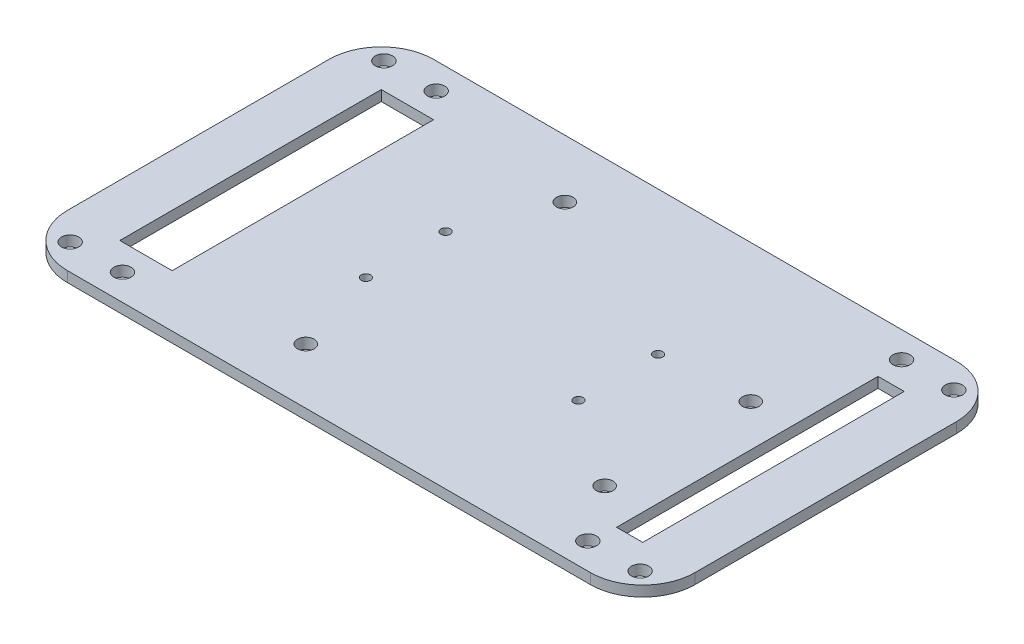
ISO-10303-21;
HEADER;
FILE_DESCRIPTION(('STEP AP214'),'2;1');
FILE_NAME('part.step','',(''),(''),'','','');
FILE_SCHEMA(('AUTOMOTIVE_DESIGN { 1 0 10303 214 1 1 1 1 }'));
ENDSEC;
DATA;
#1=APPLICATION_CONTEXT('core data for automotive mechanical design processes');
#2=APPLICATION_PROTOCOL_DEFINITION('international standard','automotive_design',2000,#1);
#3=PRODUCT_CONTEXT('',#1,'mechanical');
#4=PRODUCT('Part','Part','',(#3));
#5=PRODUCT_RELATED_PRODUCT_CATEGORY('part','',(#4));
#6=PRODUCT_DEFINITION_FORMATION('','',#4);
#7=PRODUCT_DEFINITION_CONTEXT('part definition',#1,'design');
#8=PRODUCT_DEFINITION('design','',#6,#7);
#9=PRODUCT_DEFINITION_SHAPE('','',#8);
#10=(LENGTH_UNIT() NAMED_UNIT(*) SI_UNIT(.MILLI.,.METRE.));
#11=(NAMED_UNIT(*) PLANE_ANGLE_UNIT() SI_UNIT($,.RADIAN.));
#12=(NAMED_UNIT(*) SI_UNIT($,.STERADIAN.) SOLID_ANGLE_UNIT());
#13=UNCERTAINTY_MEASURE_WITH_UNIT(LENGTH_MEASURE(1.E-05),#10,'distance_accuracy_value','');
#14=(GEOMETRIC_REPRESENTATION_CONTEXT(3) GLOBAL_UNCERTAINTY_ASSIGNED_CONTEXT((#13)) GLOBAL_UNIT_ASSIGNED_CONTEXT((#10,
#11,#12)) REPRESENTATION_CONTEXT('',''));
#15=CARTESIAN_POINT('',(0.,0.,0.));
#16=DIRECTION('',(0.,0.,1.));
#17=DIRECTION('',(1.,0.,0.));
#18=AXIS2_PLACEMENT_3D('',#15,#16,#17);
#19=CARTESIAN_POINT('',(110.,2.,-10.));
#20=DIRECTION('',(0.,-1.,0.));
#21=DIRECTION('',(0.,0.,-1.));
#22=AXIS2_PLACEMENT_3D('',#19,#20,#21);
#23=CYLINDRICAL_SURFACE('',#22,10.);
#24=DIRECTION('',(0.,-1.,0.));
#25=VECTOR('',#24,1.);
#26=CARTESIAN_POINT('',(120.,2.,-10.));
#27=LINE('',#26,#25);
#28=CARTESIAN_POINT('',(120.,2.,-10.));
#29=VERTEX_POINT('',#28);
#30=CARTESIAN_POINT('',(120.,0.,-10.));
#31=VERTEX_POINT('',#30);
#32=EDGE_CURVE('E271',#29,#31,#27,.T.);
#33=ORIENTED_EDGE('',*,*,#32,.F.);
#34=CARTESIAN_POINT('',(110.,2.,-10.));
#35=DIRECTION('',(0.,-1.,0.));
#36=DIRECTION('',(0.,0.,-1.));
#37=AXIS2_PLACEMENT_3D('',#34,#35,#36);
#38=CIRCLE('',#37,10.);
#39=CARTESIAN_POINT('',(110.,2.,0.));
#40=VERTEX_POINT('',#39);
#41=EDGE_CURVE('E277',#40,#29,#38,.F.);
#42=ORIENTED_EDGE('',*,*,#41,.F.);
#43=DIRECTION('',(0.,-1.,0.));
#44=VECTOR('',#43,1.);
#45=CARTESIAN_POINT('',(110.,2.,0.));
#46=LINE('',#45,#44);
#47=CARTESIAN_POINT('',(110.,0.,0.));
#48=VERTEX_POINT('',#47);
#49=EDGE_CURVE('E274',#48,#40,#46,.F.);
#50=ORIENTED_EDGE('',*,*,#49,.F.);
#51=CARTESIAN_POINT('',(110.,0.,-10.));
#52=DIRECTION('',(0.,-1.,0.));
#53=DIRECTION('',(0.,0.,-1.));
#54=AXIS2_PLACEMENT_3D('',#51,#52,#53);
#55=CIRCLE('',#54,10.);
#56=EDGE_CURVE('E279',#31,#48,#55,.T.);
#57=ORIENTED_EDGE('',*,*,#56,.F.);
#58=EDGE_LOOP('',(#33,#42,#50,#57));
#59=FACE_BOUND('',#58,.T.);
#60=ADVANCED_FACE('F35',(#59),#23,.T.);
#61=CARTESIAN_POINT('',(110.,2.,-60.));
#62=DIRECTION('',(0.,-1.,0.));
#63=DIRECTION('',(0.,0.,-1.));
#64=AXIS2_PLACEMENT_3D('',#61,#62,#63);
#65=CYLINDRICAL_SURFACE('',#64,10.);
#66=DIRECTION('',(0.,-1.,0.));
#67=VECTOR('',#66,1.);
#68=CARTESIAN_POINT('',(110.,2.,-70.));
#69=LINE('',#68,#67);
#70=CARTESIAN_POINT('',(110.,2.,-70.));
#71=VERTEX_POINT('',#70);
#72=CARTESIAN_POINT('',(110.,0.,-70.));
#73=VERTEX_POINT('',#72);
#74=EDGE_CURVE('E260',#71,#73,#69,.T.);
#75=ORIENTED_EDGE('',*,*,#74,.F.);
#76=CARTESIAN_POINT('',(110.,2.,-60.));
#77=DIRECTION('',(0.,-1.,0.));
#78=DIRECTION('',(0.,0.,-1.));
#79=AXIS2_PLACEMENT_3D('',#76,#77,#78);
#80=CIRCLE('',#79,10.);
#81=CARTESIAN_POINT('',(120.,2.,-60.));
#82=VERTEX_POINT('',#81);
#83=EDGE_CURVE('E266',#82,#71,#80,.F.);
#84=ORIENTED_EDGE('',*,*,#83,.F.);
#85=DIRECTION('',(0.,-1.,0.));
#86=VECTOR('',#85,1.);
#87=CARTESIAN_POINT('',(120.,2.,-60.));
#88=LINE('',#87,#86);
#89=CARTESIAN_POINT('',(120.,0.,-60.));
#90=VERTEX_POINT('',#89);
#91=EDGE_CURVE('E263',#90,#82,#88,.F.);
#92=ORIENTED_EDGE('',*,*,#91,.F.);
#93=CARTESIAN_POINT('',(110.,0.,-60.));
#94=DIRECTION('',(0.,-1.,0.));
#95=DIRECTION('',(0.,0.,-1.));
#96=AXIS2_PLACEMENT_3D('',#93,#94,#95);
#97=CIRCLE('',#96,10.);
#98=EDGE_CURVE('E268',#73,#90,#97,.T.);
#99=ORIENTED_EDGE('',*,*,#98,.F.);
#100=EDGE_LOOP('',(#75,#84,#92,#99));
#101=FACE_BOUND('',#100,.T.);
#102=ADVANCED_FACE('F386',(#101),#65,.T.);
#103=CARTESIAN_POINT('',(10.,2.,-60.));
#104=DIRECTION('',(0.,1.,0.));
#105=DIRECTION('',(0.,0.,1.));
#106=AXIS2_PLACEMENT_3D('',#103,#104,#105);
#107=CYLINDRICAL_SURFACE('',#106,10.);
#108=DIRECTION('',(0.,1.,0.));
#109=VECTOR('',#108,1.);
#110=CARTESIAN_POINT('',(10.,2.,-70.));
#111=LINE('',#110,#109);
#112=CARTESIAN_POINT('',(10.,0.,-70.));
#113=VERTEX_POINT('',#112);
#114=CARTESIAN_POINT('',(10.,2.,-70.));
#115=VERTEX_POINT('',#114);
#116=EDGE_CURVE('E249',#113,#115,#111,.T.);
#117=ORIENTED_EDGE('',*,*,#116,.F.);
#118=CARTESIAN_POINT('',(10.,0.,-60.));
#119=DIRECTION('',(0.,-1.,0.));
#120=DIRECTION('',(0.,0.,-1.));
#121=AXIS2_PLACEMENT_3D('',#118,#119,#120);
#122=CIRCLE('',#121,10.);
#123=CARTESIAN_POINT('',(0.,0.,-60.));
#124=VERTEX_POINT('',#123);
#125=EDGE_CURVE('E255',#124,#113,#122,.T.);
#126=ORIENTED_EDGE('',*,*,#125,.F.);
#127=DIRECTION('',(0.,1.,0.));
#128=VECTOR('',#127,1.);
#129=CARTESIAN_POINT('',(0.,2.,-60.));
#130=LINE('',#129,#128);
#131=CARTESIAN_POINT('',(0.,2.,-60.));
#132=VERTEX_POINT('',#131);
#133=EDGE_CURVE('E252',#132,#124,#130,.F.);
#134=ORIENTED_EDGE('',*,*,#133,.F.);
#135=CARTESIAN_POINT('',(10.,2.,-60.));
#136=DIRECTION('',(0.,-1.,0.));
#137=DIRECTION('',(0.,0.,-1.));
#138=AXIS2_PLACEMENT_3D('',#135,#136,#137);
#139=CIRCLE('',#138,10.);
#140=EDGE_CURVE('E258',#115,#132,#139,.F.);
#141=ORIENTED_EDGE('',*,*,#140,.F.);
#142=EDGE_LOOP('',(#117,#126,#134,#141));
#143=FACE_BOUND('',#142,.T.);
#144=ADVANCED_FACE('F379',(#143),#107,.T.);
#145=CARTESIAN_POINT('',(10.,2.,-10.));
#146=DIRECTION('',(0.,1.,0.));
#147=DIRECTION('',(0.,0.,1.));
#148=AXIS2_PLACEMENT_3D('',#145,#146,#147);
#149=CYLINDRICAL_SURFACE('',#148,10.);
#150=DIRECTION('',(0.,1.,0.));
#151=VECTOR('',#150,1.);
#152=CARTESIAN_POINT('',(0.,2.,-10.));
#153=LINE('',#152,#151);
#154=CARTESIAN_POINT('',(0.,0.,-10.));
#155=VERTEX_POINT('',#154);
#156=CARTESIAN_POINT('',(0.,2.,-10.));
#157=VERTEX_POINT('',#156);
#158=EDGE_CURVE('E231',#155,#157,#153,.T.);
#159=ORIENTED_EDGE('',*,*,#158,.F.);
#160=CARTESIAN_POINT('',(10.,0.,-10.));
#161=DIRECTION('',(0.,-1.,0.));
#162=DIRECTION('',(0.,0.,-1.));
#163=AXIS2_PLACEMENT_3D('',#160,#161,#162);
#164=CIRCLE('',#163,10.);
#165=CARTESIAN_POINT('',(10.,0.,0.));
#166=VERTEX_POINT('',#165);
#167=EDGE_CURVE('E244',#166,#155,#164,.T.);
#168=ORIENTED_EDGE('',*,*,#167,.F.);
#169=DIRECTION('',(0.,1.,0.));
#170=VECTOR('',#169,1.);
#171=CARTESIAN_POINT('',(10.,2.,0.));
#172=LINE('',#171,#170);
#173=CARTESIAN_POINT('',(10.,2.,0.));
#174=VERTEX_POINT('',#173);
#175=EDGE_CURVE('E241',#174,#166,#172,.F.);
#176=ORIENTED_EDGE('',*,*,#175,.F.);
#177=CARTESIAN_POINT('',(10.,2.,-10.));
#178=DIRECTION('',(0.,-1.,0.));
#179=DIRECTION('',(0.,0.,-1.));
#180=AXIS2_PLACEMENT_3D('',#177,#178,#179);
#181=CIRCLE('',#180,10.);
#182=EDGE_CURVE('E247',#157,#174,#181,.F.);
#183=ORIENTED_EDGE('',*,*,#182,.F.);
#184=EDGE_LOOP('',(#159,#168,#176,#183));
#185=FACE_BOUND('',#184,.T.);
#186=ADVANCED_FACE('F369',(#185),#149,.T.);
#187=CARTESIAN_POINT('',(0.,2.,0.));
#188=DIRECTION('',(0.,-1.,0.));
#189=DIRECTION('',(0.,0.,-1.));
#190=AXIS2_PLACEMENT_3D('',#187,#188,#189);
#191=PLANE('',#190);
#192=CARTESIAN_POINT('',(39.68,2.,-27.38));
#193=DIRECTION('',(0.,1.,0.));
#194=DIRECTION('',(0.,0.,1.));
#195=AXIS2_PLACEMENT_3D('',#192,#193,#194);
#196=CIRCLE('',#195,0.899999999999996);
#197=CARTESIAN_POINT('',(39.68,2.,-26.48));
#198=VERTEX_POINT('',#197);
#199=EDGE_CURVE('E328',#198,#198,#196,.T.);
#200=ORIENTED_EDGE('',*,*,#199,.F.);
#201=EDGE_LOOP('',(#200));
#202=FACE_BOUND('',#201,.T.);
#203=CARTESIAN_POINT('',(80.32,2.,-42.62));
#204=DIRECTION('',(0.,1.,0.));
#205=DIRECTION('',(0.,0.,1.));
#206=AXIS2_PLACEMENT_3D('',#203,#204,#205);
#207=CIRCLE('',#206,0.900000000000003);
#208=CARTESIAN_POINT('',(80.32,2.,-41.72));
#209=VERTEX_POINT('',#208);
#210=EDGE_CURVE('E716',#209,#209,#207,.T.);
#211=ORIENTED_EDGE('',*,*,#210,.F.);
#212=EDGE_LOOP('',(#211));
#213=FACE_BOUND('',#212,.T.);
#214=CARTESIAN_POINT('',(80.32,2.,-27.38));
#215=DIRECTION('',(0.,1.,0.));
#216=DIRECTION('',(0.,0.,1.));
#217=AXIS2_PLACEMENT_3D('',#214,#215,#216);
#218=CIRCLE('',#217,0.900000000000003);
#219=CARTESIAN_POINT('',(80.32,2.,-26.48));
#220=VERTEX_POINT('',#219);
#221=EDGE_CURVE('E341',#220,#220,#218,.T.);
#222=ORIENTED_EDGE('',*,*,#221,.F.);
#223=EDGE_LOOP('',(#222));
#224=FACE_BOUND('',#223,.T.);
#225=CARTESIAN_POINT('',(39.68,2.,-42.62));
#226=DIRECTION('',(0.,1.,0.));
#227=DIRECTION('',(0.,0.,1.));
#228=AXIS2_PLACEMENT_3D('',#225,#226,#227);
#229=CIRCLE('',#228,0.899999999999996);
#230=CARTESIAN_POINT('',(39.68,2.,-41.72));
#231=VERTEX_POINT('',#230);
#232=EDGE_CURVE('E324',#231,#231,#229,.T.);
#233=ORIENTED_EDGE('',*,*,#232,.F.);
#234=EDGE_LOOP('',(#233));
#235=FACE_BOUND('',#234,.T.);
#236=CARTESIAN_POINT('',(104.5,2.,-5.));
#237=DIRECTION('',(0.,1.,0.));
#238=DIRECTION('',(0.,0.,1.));
#239=AXIS2_PLACEMENT_3D('',#236,#237,#238);
#240=CIRCLE('',#239,1.65);
#241=CARTESIAN_POINT('',(104.5,2.,-3.35));
#242=VERTEX_POINT('',#241);
#243=EDGE_CURVE('E323',#242,#242,#240,.T.);
#244=ORIENTED_EDGE('',*,*,#243,.F.);
#245=EDGE_LOOP('',(#244));
#246=FACE_BOUND('',#245,.T.);
#247=CARTESIAN_POINT('',(15.5,2.,-5.));
#248=DIRECTION('',(0.,1.,0.));
#249=DIRECTION('',(0.,0.,1.));
#250=AXIS2_PLACEMENT_3D('',#247,#248,#249);
#251=CIRCLE('',#250,1.65);
#252=CARTESIAN_POINT('',(15.5,2.,-3.35));
#253=VERTEX_POINT('',#252);
#254=EDGE_CURVE('E350',#253,#253,#251,.T.);
#255=ORIENTED_EDGE('',*,*,#254,.F.);
#256=EDGE_LOOP('',(#255));
#257=FACE_BOUND('',#256,.T.);
#258=CARTESIAN_POINT('',(104.5,2.,-65.));
#259=DIRECTION('',(0.,1.,0.));
#260=DIRECTION('',(0.,0.,1.));
#261=AXIS2_PLACEMENT_3D('',#258,#259,#260);
#262=CIRCLE('',#261,1.65);
#263=CARTESIAN_POINT('',(104.5,2.,-63.35));
#264=VERTEX_POINT('',#263);
#265=EDGE_CURVE('E347',#264,#264,#262,.T.);
#266=ORIENTED_EDGE('',*,*,#265,.F.);
#267=EDGE_LOOP('',(#266));
#268=FACE_BOUND('',#267,.T.);
#269=CARTESIAN_POINT('',(15.5,2.,-65.));
#270=DIRECTION('',(0.,1.,0.));
#271=DIRECTION('',(0.,0.,1.));
#272=AXIS2_PLACEMENT_3D('',#269,#270,#271);
#273=CIRCLE('',#272,1.65);
#274=CARTESIAN_POINT('',(15.5,2.,-63.35));
#275=VERTEX_POINT('',#274);
#276=EDGE_CURVE('E343',#275,#275,#273,.T.);
#277=ORIENTED_EDGE('',*,*,#276,.F.);
#278=EDGE_LOOP('',(#277));
#279=FACE_BOUND('',#278,.T.);
#280=CARTESIAN_POINT('',(5.49999999999999,2.,-65.));
#281=DIRECTION('',(0.,1.,0.));
#282=DIRECTION('',(0.,0.,1.));
#283=AXIS2_PLACEMENT_3D('',#280,#281,#282);
#284=CIRCLE('',#283,1.65);
#285=CARTESIAN_POINT('',(5.49999999999999,2.,-63.35));
#286=VERTEX_POINT('',#285);
#287=EDGE_CURVE('E346',#286,#286,#284,.T.);
#288=ORIENTED_EDGE('',*,*,#287,.F.);
#289=EDGE_LOOP('',(#288));
#290=FACE_BOUND('',#289,.T.);
#291=CARTESIAN_POINT('',(114.5,2.,-65.));
#292=DIRECTION('',(0.,1.,0.));
#293=DIRECTION('',(0.,0.,1.));
#294=AXIS2_PLACEMENT_3D('',#291,#292,#293);
#295=CIRCLE('',#294,1.65);
#296=CARTESIAN_POINT('',(114.5,2.,-63.35));
#297=VERTEX_POINT('',#296);
#298=EDGE_CURVE('E357',#297,#297,#295,.T.);
#299=ORIENTED_EDGE('',*,*,#298,.F.);
#300=EDGE_LOOP('',(#299));
#301=FACE_BOUND('',#300,.T.);
#302=CARTESIAN_POINT('',(114.5,2.,-5.));
#303=DIRECTION('',(0.,1.,0.));
#304=DIRECTION('',(0.,0.,1.));
#305=AXIS2_PLACEMENT_3D('',#302,#303,#304);
#306=CIRCLE('',#305,1.65);
#307=CARTESIAN_POINT('',(114.5,2.,-3.35));
#308=VERTEX_POINT('',#307);
#309=EDGE_CURVE('E302',#308,#308,#306,.T.);
#310=ORIENTED_EDGE('',*,*,#309,.F.);
#311=EDGE_LOOP('',(#310));
#312=FACE_BOUND('',#311,.T.);
#313=CARTESIAN_POINT('',(5.5,2.,-5.));
#314=DIRECTION('',(0.,1.,0.));
#315=DIRECTION('',(0.,0.,1.));
#316=AXIS2_PLACEMENT_3D('',#313,#314,#315);
#317=CIRCLE('',#316,1.65);
#318=CARTESIAN_POINT('',(5.5,2.,-3.35));
#319=VERTEX_POINT('',#318);
#320=EDGE_CURVE('E297',#319,#319,#317,.T.);
#321=ORIENTED_EDGE('',*,*,#320,.F.);
#322=EDGE_LOOP('',(#321));
#323=FACE_BOUND('',#322,.T.);
#324=DIRECTION('',(-1.,0.,0.));
#325=VECTOR('',#324,1.);
#326=CARTESIAN_POINT('',(110.,2.,-60.));
#327=LINE('',#326,#325);
#328=CARTESIAN_POINT('',(110.,2.,-60.));
#329=VERTEX_POINT('',#328);
#330=CARTESIAN_POINT('',(105.,2.,-60.));
#331=VERTEX_POINT('',#330);
#332=EDGE_CURVE('E160',#329,#331,#327,.T.);
#333=ORIENTED_EDGE('',*,*,#332,.F.);
#334=DIRECTION('',(0.,0.,-1.));
#335=VECTOR('',#334,1.);
#336=CARTESIAN_POINT('',(110.,2.,-60.));
#337=LINE('',#336,#335);
#338=CARTESIAN_POINT('',(110.,2.,-10.));
#339=VERTEX_POINT('',#338);
#340=EDGE_CURVE('E51',#339,#329,#337,.T.);
#341=ORIENTED_EDGE('',*,*,#340,.F.);
#342=DIRECTION('',(1.,0.,0.));
#343=VECTOR('',#342,1.);
#344=CARTESIAN_POINT('',(110.,2.,-10.));
#345=LINE('',#344,#343);
#346=CARTESIAN_POINT('',(105.,2.,-10.));
#347=VERTEX_POINT('',#346);
#348=EDGE_CURVE('E167',#347,#339,#345,.T.);
#349=ORIENTED_EDGE('',*,*,#348,.F.);
#350=DIRECTION('',(0.,0.,1.));
#351=VECTOR('',#350,1.);
#352=CARTESIAN_POINT('',(105.,2.,-60.));
#353=LINE('',#352,#351);
#354=EDGE_CURVE('E151',#331,#347,#353,.T.);
#355=ORIENTED_EDGE('',*,*,#354,.F.);
#356=EDGE_LOOP('',(#333,#341,#349,#355));
#357=FACE_BOUND('',#356,.T.);
#358=DIRECTION('',(-1.,0.,0.));
#359=VECTOR('',#358,1.);
#360=CARTESIAN_POINT('',(20.,2.,-60.));
#361=LINE('',#360,#359);
#362=CARTESIAN_POINT('',(20.,2.,-60.));
#363=VERTEX_POINT('',#362);
#364=CARTESIAN_POINT('',(10.,2.,-60.));
#365=VERTEX_POINT('',#364);
#366=EDGE_CURVE('E178',#363,#365,#361,.T.);
#367=ORIENTED_EDGE('',*,*,#366,.F.);
#368=DIRECTION('',(0.,0.,-1.));
#369=VECTOR('',#368,1.);
#370=CARTESIAN_POINT('',(20.,2.,-60.));
#371=LINE('',#370,#369);
#372=CARTESIAN_POINT('',(20.,2.,-10.));
#373=VERTEX_POINT('',#372);
#374=EDGE_CURVE('E174',#373,#363,#371,.T.);
#375=ORIENTED_EDGE('',*,*,#374,.F.);
#376=DIRECTION('',(1.,0.,0.));
#377=VECTOR('',#376,1.);
#378=CARTESIAN_POINT('',(20.,2.,-10.));
#379=LINE('',#378,#377);
#380=CARTESIAN_POINT('',(10.,2.,-10.));
#381=VERTEX_POINT('',#380);
#382=EDGE_CURVE('E184',#381,#373,#379,.T.);
#383=ORIENTED_EDGE('',*,*,#382,.F.);
#384=DIRECTION('',(0.,0.,1.));
#385=VECTOR('',#384,1.);
#386=CARTESIAN_POINT('',(10.,2.,-60.));
#387=LINE('',#386,#385);
#388=EDGE_CURVE('E181',#365,#381,#387,.T.);
#389=ORIENTED_EDGE('',*,*,#388,.F.);
#390=EDGE_LOOP('',(#367,#375,#383,#389));
#391=FACE_BOUND('',#390,.T.);
#392=DIRECTION('',(1.,0.,0.));
#393=VECTOR('',#392,1.);
#394=CARTESIAN_POINT('',(0.,2.,0.));
#395=LINE('',#394,#393);
#396=EDGE_CURVE('E223',#174,#40,#395,.T.);
#397=ORIENTED_EDGE('',*,*,#396,.T.);
#398=ORIENTED_EDGE('',*,*,#41,.T.);
#399=DIRECTION('',(0.,0.,-1.));
#400=VECTOR('',#399,1.);
#401=CARTESIAN_POINT('',(120.,2.,0.));
#402=LINE('',#401,#400);
#403=EDGE_CURVE('E227',#29,#82,#402,.T.);
#404=ORIENTED_EDGE('',*,*,#403,.T.);
#405=ORIENTED_EDGE('',*,*,#83,.T.);
#406=DIRECTION('',(-1.,0.,0.));
#407=VECTOR('',#406,1.);
#408=CARTESIAN_POINT('',(0.,2.,-70.));
#409=LINE('',#408,#407);
#410=EDGE_CURVE('E229',#71,#115,#409,.T.);
#411=ORIENTED_EDGE('',*,*,#410,.T.);
#412=ORIENTED_EDGE('',*,*,#140,.T.);
#413=DIRECTION('',(0.,0.,1.));
#414=VECTOR('',#413,1.);
#415=CARTESIAN_POINT('',(0.,2.,0.));
#416=LINE('',#415,#414);
#417=EDGE_CURVE('E221',#132,#157,#416,.T.);
#418=ORIENTED_EDGE('',*,*,#417,.T.);
#419=ORIENTED_EDGE('',*,*,#182,.T.);
#420=EDGE_LOOP('',(#397,#398,#404,#405,#411,#412,#418,#419));
#421=FACE_BOUND('',#420,.T.);
#422=CARTESIAN_POINT('',(97.,2.,-43.66));
#423=DIRECTION('',(0.,1.,0.));
#424=DIRECTION('',(0.,0.,1.));
#425=AXIS2_PLACEMENT_3D('',#422,#423,#424);
#426=CIRCLE('',#425,1.60000000000001);
#427=CARTESIAN_POINT('',(97.,2.,-42.06));
#428=VERTEX_POINT('',#427);
#429=EDGE_CURVE('E215',#428,#428,#426,.T.);
#430=ORIENTED_EDGE('',*,*,#429,.F.);
#431=EDGE_LOOP('',(#430));
#432=FACE_BOUND('',#431,.T.);
#433=CARTESIAN_POINT('',(97.,2.,-15.72));
#434=DIRECTION('',(0.,1.,0.));
#435=DIRECTION('',(0.,0.,1.));
#436=AXIS2_PLACEMENT_3D('',#433,#434,#435);
#437=CIRCLE('',#436,1.6);
#438=CARTESIAN_POINT('',(97.,2.,-14.12));
#439=VERTEX_POINT('',#438);
#440=EDGE_CURVE('E209',#439,#439,#437,.T.);
#441=ORIENTED_EDGE('',*,*,#440,.F.);
#442=EDGE_LOOP('',(#441));
#443=FACE_BOUND('',#442,.T.);
#444=CARTESIAN_POINT('',(46.2,2.,-58.9));
#445=DIRECTION('',(0.,1.,0.));
#446=DIRECTION('',(0.,0.,1.));
#447=AXIS2_PLACEMENT_3D('',#444,#445,#446);
#448=CIRCLE('',#447,1.6);
#449=CARTESIAN_POINT('',(46.2,2.,-57.3));
#450=VERTEX_POINT('',#449);
#451=EDGE_CURVE('E203',#450,#450,#448,.T.);
#452=ORIENTED_EDGE('',*,*,#451,.F.);
#453=EDGE_LOOP('',(#452));
#454=FACE_BOUND('',#453,.T.);
#455=CARTESIAN_POINT('',(44.93,2.,-10.64));
#456=DIRECTION('',(0.,1.,0.));
#457=DIRECTION('',(0.,0.,1.));
#458=AXIS2_PLACEMENT_3D('',#455,#456,#457);
#459=CIRCLE('',#458,1.6);
#460=CARTESIAN_POINT('',(44.93,2.,-9.04000000000001));
#461=VERTEX_POINT('',#460);
#462=EDGE_CURVE('E197',#461,#461,#459,.T.);
#463=ORIENTED_EDGE('',*,*,#462,.F.);
#464=EDGE_LOOP('',(#463));
#465=FACE_BOUND('',#464,.T.);
#466=ADVANCED_FACE('F164',(#202,#213,#224,#235,#246,#257,#268,#279,#290,#301,#312,#323,#357,
#391,#421,#432,#443,#454,#465),#191,.F.);
#467=CARTESIAN_POINT('',(0.,0.,0.));
#468=DIRECTION('',(0.,-1.,0.));
#469=DIRECTION('',(0.,0.,-1.));
#470=AXIS2_PLACEMENT_3D('',#467,#468,#469);
#471=PLANE('',#470);
#472=CARTESIAN_POINT('',(39.68,0.,-27.38));
#473=DIRECTION('',(0.,-1.,0.));
#474=DIRECTION('',(0.,0.,-1.));
#475=AXIS2_PLACEMENT_3D('',#472,#473,#474);
#476=CIRCLE('',#475,0.899999999999996);
#477=CARTESIAN_POINT('',(39.68,0.,-28.28));
#478=VERTEX_POINT('',#477);
#479=EDGE_CURVE('E38',#478,#478,#476,.T.);
#480=ORIENTED_EDGE('',*,*,#479,.F.);
#481=EDGE_LOOP('',(#480));
#482=FACE_BOUND('',#481,.T.);
#483=CARTESIAN_POINT('',(80.32,0.,-42.62));
#484=DIRECTION('',(0.,-1.,0.));
#485=DIRECTION('',(0.,0.,-1.));
#486=AXIS2_PLACEMENT_3D('',#483,#484,#485);
#487=CIRCLE('',#486,0.900000000000003);
#488=CARTESIAN_POINT('',(80.32,0.,-43.52));
#489=VERTEX_POINT('',#488);
#490=EDGE_CURVE('E327',#489,#489,#487,.T.);
#491=ORIENTED_EDGE('',*,*,#490,.F.);
#492=EDGE_LOOP('',(#491));
#493=FACE_BOUND('',#492,.T.);
#494=CARTESIAN_POINT('',(80.32,0.,-27.38));
#495=DIRECTION('',(0.,-1.,0.));
#496=DIRECTION('',(0.,0.,-1.));
#497=AXIS2_PLACEMENT_3D('',#494,#495,#496);
#498=CIRCLE('',#497,0.900000000000003);
#499=CARTESIAN_POINT('',(80.32,0.,-28.28));
#500=VERTEX_POINT('',#499);
#501=EDGE_CURVE('E325',#500,#500,#498,.T.);
#502=ORIENTED_EDGE('',*,*,#501,.F.);
#503=EDGE_LOOP('',(#502));
#504=FACE_BOUND('',#503,.T.);
#505=CARTESIAN_POINT('',(39.68,0.,-42.62));
#506=DIRECTION('',(0.,-1.,0.));
#507=DIRECTION('',(0.,0.,-1.));
#508=AXIS2_PLACEMENT_3D('',#505,#506,#507);
#509=CIRCLE('',#508,0.899999999999996);
#510=CARTESIAN_POINT('',(39.68,0.,-43.52));
#511=VERTEX_POINT('',#510);
#512=EDGE_CURVE('E320',#511,#511,#509,.T.);
#513=ORIENTED_EDGE('',*,*,#512,.F.);
#514=EDGE_LOOP('',(#513));
#515=FACE_BOUND('',#514,.T.);
#516=CARTESIAN_POINT('',(104.5,0.,-5.));
#517=DIRECTION('',(0.,-1.,0.));
#518=DIRECTION('',(0.,0.,-1.));
#519=AXIS2_PLACEMENT_3D('',#516,#517,#518);
#520=CIRCLE('',#519,1.65);
#521=CARTESIAN_POINT('',(104.5,0.,-6.65000000000001));
#522=VERTEX_POINT('',#521);
#523=EDGE_CURVE('E317',#522,#522,#520,.T.);
#524=ORIENTED_EDGE('',*,*,#523,.F.);
#525=EDGE_LOOP('',(#524));
#526=FACE_BOUND('',#525,.T.);
#527=CARTESIAN_POINT('',(15.5,0.,-5.));
#528=DIRECTION('',(0.,-1.,0.));
#529=DIRECTION('',(0.,0.,-1.));
#530=AXIS2_PLACEMENT_3D('',#527,#528,#529);
#531=CIRCLE('',#530,1.65);
#532=CARTESIAN_POINT('',(15.5,0.,-6.65));
#533=VERTEX_POINT('',#532);
#534=EDGE_CURVE('E314',#533,#533,#531,.T.);
#535=ORIENTED_EDGE('',*,*,#534,.F.);
#536=EDGE_LOOP('',(#535));
#537=FACE_BOUND('',#536,.T.);
#538=CARTESIAN_POINT('',(104.5,0.,-65.));
#539=DIRECTION('',(0.,-1.,0.));
#540=DIRECTION('',(0.,0.,-1.));
#541=AXIS2_PLACEMENT_3D('',#538,#539,#540);
#542=CIRCLE('',#541,1.65);
#543=CARTESIAN_POINT('',(104.5,0.,-66.65));
#544=VERTEX_POINT('',#543);
#545=EDGE_CURVE('E311',#544,#544,#542,.T.);
#546=ORIENTED_EDGE('',*,*,#545,.F.);
#547=EDGE_LOOP('',(#546));
#548=FACE_BOUND('',#547,.T.);
#549=CARTESIAN_POINT('',(15.5,0.,-65.));
#550=DIRECTION('',(0.,-1.,0.));
#551=DIRECTION('',(0.,0.,-1.));
#552=AXIS2_PLACEMENT_3D('',#549,#550,#551);
#553=CIRCLE('',#552,1.65);
#554=CARTESIAN_POINT('',(15.5,0.,-66.65));
#555=VERTEX_POINT('',#554);
#556=EDGE_CURVE('E308',#555,#555,#553,.T.);
#557=ORIENTED_EDGE('',*,*,#556,.F.);
#558=EDGE_LOOP('',(#557));
#559=FACE_BOUND('',#558,.T.);
#560=CARTESIAN_POINT('',(5.49999999999999,0.,-65.));
#561=DIRECTION('',(0.,-1.,0.));
#562=DIRECTION('',(0.,0.,-1.));
#563=AXIS2_PLACEMENT_3D('',#560,#561,#562);
#564=CIRCLE('',#563,1.65);
#565=CARTESIAN_POINT('',(5.49999999999999,0.,-66.65));
#566=VERTEX_POINT('',#565);
#567=EDGE_CURVE('E305',#566,#566,#564,.T.);
#568=ORIENTED_EDGE('',*,*,#567,.F.);
#569=EDGE_LOOP('',(#568));
#570=FACE_BOUND('',#569,.T.);
#571=CARTESIAN_POINT('',(114.5,0.,-65.));
#572=DIRECTION('',(0.,-1.,0.));
#573=DIRECTION('',(0.,0.,-1.));
#574=AXIS2_PLACEMENT_3D('',#571,#572,#573);
#575=CIRCLE('',#574,1.65);
#576=CARTESIAN_POINT('',(114.5,0.,-66.65));
#577=VERTEX_POINT('',#576);
#578=EDGE_CURVE('E301',#577,#577,#575,.T.);
#579=ORIENTED_EDGE('',*,*,#578,.F.);
#580=EDGE_LOOP('',(#579));
#581=FACE_BOUND('',#580,.T.);
#582=CARTESIAN_POINT('',(114.5,0.,-5.));
#583=DIRECTION('',(0.,-1.,0.));
#584=DIRECTION('',(0.,0.,-1.));
#585=AXIS2_PLACEMENT_3D('',#582,#583,#584);
#586=CIRCLE('',#585,1.65);
#587=CARTESIAN_POINT('',(114.5,0.,-6.65000000000001));
#588=VERTEX_POINT('',#587);
#589=EDGE_CURVE('E298',#588,#588,#586,.T.);
#590=ORIENTED_EDGE('',*,*,#589,.F.);
#591=EDGE_LOOP('',(#590));
#592=FACE_BOUND('',#591,.T.);
#593=CARTESIAN_POINT('',(5.5,0.,-5.));
#594=DIRECTION('',(0.,-1.,0.));
#595=DIRECTION('',(0.,0.,-1.));
#596=AXIS2_PLACEMENT_3D('',#593,#594,#595);
#597=CIRCLE('',#596,1.65);
#598=CARTESIAN_POINT('',(5.5,0.,-6.65));
#599=VERTEX_POINT('',#598);
#600=EDGE_CURVE('E294',#599,#599,#597,.T.);
#601=ORIENTED_EDGE('',*,*,#600,.F.);
#602=EDGE_LOOP('',(#601));
#603=FACE_BOUND('',#602,.T.);
#604=DIRECTION('',(0.,0.,1.));
#605=VECTOR('',#604,1.);
#606=CARTESIAN_POINT('',(110.,0.,0.));
#607=LINE('',#606,#605);
#608=CARTESIAN_POINT('',(110.,0.,-60.));
#609=VERTEX_POINT('',#608);
#610=CARTESIAN_POINT('',(110.,0.,-10.));
#611=VERTEX_POINT('',#610);
#612=EDGE_CURVE('E11',#609,#611,#607,.T.);
#613=ORIENTED_EDGE('',*,*,#612,.F.);
#614=DIRECTION('',(1.,0.,0.));
#615=VECTOR('',#614,1.);
#616=CARTESIAN_POINT('',(0.,0.,-60.));
#617=LINE('',#616,#615);
#618=CARTESIAN_POINT('',(105.,0.,-60.));
#619=VERTEX_POINT('',#618);
#620=EDGE_CURVE('E290',#619,#609,#617,.T.);
#621=ORIENTED_EDGE('',*,*,#620,.F.);
#622=DIRECTION('',(0.,0.,-1.));
#623=VECTOR('',#622,1.);
#624=CARTESIAN_POINT('',(105.,0.,0.));
#625=LINE('',#624,#623);
#626=CARTESIAN_POINT('',(105.,0.,-10.));
#627=VERTEX_POINT('',#626);
#628=EDGE_CURVE('E154',#627,#619,#625,.T.);
#629=ORIENTED_EDGE('',*,*,#628,.F.);
#630=DIRECTION('',(-1.,0.,0.));
#631=VECTOR('',#630,1.);
#632=CARTESIAN_POINT('',(0.,0.,-10.));
#633=LINE('',#632,#631);
#634=EDGE_CURVE('E43',#611,#627,#633,.T.);
#635=ORIENTED_EDGE('',*,*,#634,.F.);
#636=EDGE_LOOP('',(#613,#621,#629,#635));
#637=FACE_BOUND('',#636,.T.);
#638=DIRECTION('',(0.,0.,1.));
#639=VECTOR('',#638,1.);
#640=CARTESIAN_POINT('',(20.,0.,0.));
#641=LINE('',#640,#639);
#642=CARTESIAN_POINT('',(20.,0.,-60.));
#643=VERTEX_POINT('',#642);
#644=CARTESIAN_POINT('',(20.,0.,-10.));
#645=VERTEX_POINT('',#644);
#646=EDGE_CURVE('E288',#643,#645,#641,.T.);
#647=ORIENTED_EDGE('',*,*,#646,.F.);
#648=DIRECTION('',(1.,0.,0.));
#649=VECTOR('',#648,1.);
#650=CARTESIAN_POINT('',(0.,0.,-60.));
#651=LINE('',#650,#649);
#652=CARTESIAN_POINT('',(10.,0.,-60.));
#653=VERTEX_POINT('',#652);
#654=EDGE_CURVE('E281',#653,#643,#651,.T.);
#655=ORIENTED_EDGE('',*,*,#654,.F.);
#656=DIRECTION('',(0.,0.,-1.));
#657=VECTOR('',#656,1.);
#658=CARTESIAN_POINT('',(10.,0.,0.));
#659=LINE('',#658,#657);
#660=CARTESIAN_POINT('',(10.,0.,-10.));
#661=VERTEX_POINT('',#660);
#662=EDGE_CURVE('E283',#661,#653,#659,.T.);
#663=ORIENTED_EDGE('',*,*,#662,.F.);
#664=DIRECTION('',(-1.,0.,0.));
#665=VECTOR('',#664,1.);
#666=CARTESIAN_POINT('',(0.,0.,-10.));
#667=LINE('',#666,#665);
#668=EDGE_CURVE('E286',#645,#661,#667,.T.);
#669=ORIENTED_EDGE('',*,*,#668,.F.);
#670=EDGE_LOOP('',(#647,#655,#663,#669));
#671=FACE_BOUND('',#670,.T.);
#672=CARTESIAN_POINT('',(46.2,0.,-58.9));
#673=DIRECTION('',(0.,1.,0.));
#674=DIRECTION('',(0.,0.,1.));
#675=AXIS2_PLACEMENT_3D('',#672,#673,#674);
#676=CIRCLE('',#675,1.6);
#677=CARTESIAN_POINT('',(46.2,0.,-57.3));
#678=VERTEX_POINT('',#677);
#679=EDGE_CURVE('E200',#678,#678,#676,.T.);
#680=ORIENTED_EDGE('',*,*,#679,.T.);
#681=EDGE_LOOP('',(#680));
#682=FACE_BOUND('',#681,.T.);
#683=CARTESIAN_POINT('',(97.,0.,-43.66));
#684=DIRECTION('',(0.,1.,0.));
#685=DIRECTION('',(0.,0.,1.));
#686=AXIS2_PLACEMENT_3D('',#683,#684,#685);
#687=CIRCLE('',#686,1.60000000000001);
#688=CARTESIAN_POINT('',(97.,0.,-42.06));
#689=VERTEX_POINT('',#688);
#690=EDGE_CURVE('E212',#689,#689,#687,.T.);
#691=ORIENTED_EDGE('',*,*,#690,.T.);
#692=EDGE_LOOP('',(#691));
#693=FACE_BOUND('',#692,.T.);
#694=DIRECTION('',(0.,0.,-1.));
#695=VECTOR('',#694,1.);
#696=CARTESIAN_POINT('',(120.,0.,0.));
#697=LINE('',#696,#695);
#698=EDGE_CURVE('E236',#31,#90,#697,.T.);
#699=ORIENTED_EDGE('',*,*,#698,.F.);
#700=ORIENTED_EDGE('',*,*,#56,.T.);
#701=DIRECTION('',(1.,0.,0.));
#702=VECTOR('',#701,1.);
#703=CARTESIAN_POINT('',(0.,0.,0.));
#704=LINE('',#703,#702);
#705=EDGE_CURVE('E233',#166,#48,#704,.T.);
#706=ORIENTED_EDGE('',*,*,#705,.F.);
#707=ORIENTED_EDGE('',*,*,#167,.T.);
#708=DIRECTION('',(0.,0.,1.));
#709=VECTOR('',#708,1.);
#710=CARTESIAN_POINT('',(0.,0.,0.));
#711=LINE('',#710,#709);
#712=EDGE_CURVE('E218',#124,#155,#711,.T.);
#713=ORIENTED_EDGE('',*,*,#712,.F.);
#714=ORIENTED_EDGE('',*,*,#125,.T.);
#715=DIRECTION('',(-1.,0.,0.));
#716=VECTOR('',#715,1.);
#717=CARTESIAN_POINT('',(0.,0.,-70.));
#718=LINE('',#717,#716);
#719=EDGE_CURVE('E224',#73,#113,#718,.T.);
#720=ORIENTED_EDGE('',*,*,#719,.F.);
#721=ORIENTED_EDGE('',*,*,#98,.T.);
#722=EDGE_LOOP('',(#699,#700,#706,#707,#713,#714,#720,#721));
#723=FACE_BOUND('',#722,.T.);
#724=CARTESIAN_POINT('',(97.,0.,-15.72));
#725=DIRECTION('',(0.,1.,0.));
#726=DIRECTION('',(0.,0.,1.));
#727=AXIS2_PLACEMENT_3D('',#724,#725,#726);
#728=CIRCLE('',#727,1.6);
#729=CARTESIAN_POINT('',(97.,0.,-14.12));
#730=VERTEX_POINT('',#729);
#731=EDGE_CURVE('E206',#730,#730,#728,.T.);
#732=ORIENTED_EDGE('',*,*,#731,.T.);
#733=EDGE_LOOP('',(#732));
#734=FACE_BOUND('',#733,.T.);
#735=CARTESIAN_POINT('',(44.93,0.,-10.64));
#736=DIRECTION('',(0.,1.,0.));
#737=DIRECTION('',(0.,0.,1.));
#738=AXIS2_PLACEMENT_3D('',#735,#736,#737);
#739=CIRCLE('',#738,1.6);
#740=CARTESIAN_POINT('',(44.93,0.,-9.04000000000001));
#741=VERTEX_POINT('',#740);
#742=EDGE_CURVE('E190',#741,#741,#739,.T.);
#743=ORIENTED_EDGE('',*,*,#742,.T.);
#744=EDGE_LOOP('',(#743));
#745=FACE_BOUND('',#744,.T.);
#746=ADVANCED_FACE('F368',(#482,#493,#504,#515,#526,#537,#548,#559,#570,#581,#592,#603,#637,
#671,#682,#693,#723,#734,#745),#471,.T.);
#747=CARTESIAN_POINT('',(0.,2.,0.));
#748=DIRECTION('',(1.,0.,0.));
#749=DIRECTION('',(0.,0.,-1.));
#750=AXIS2_PLACEMENT_3D('',#747,#748,#749);
#751=PLANE('',#750);
#752=ORIENTED_EDGE('',*,*,#417,.F.);
#753=ORIENTED_EDGE('',*,*,#133,.T.);
#754=ORIENTED_EDGE('',*,*,#712,.T.);
#755=ORIENTED_EDGE('',*,*,#158,.T.);
#756=EDGE_LOOP('',(#752,#753,#754,#755));
#757=FACE_BOUND('',#756,.T.);
#758=ADVANCED_FACE('F376',(#757),#751,.F.);
#759=CARTESIAN_POINT('',(0.,2.,0.));
#760=DIRECTION('',(0.,0.,-1.));
#761=DIRECTION('',(-1.,0.,0.));
#762=AXIS2_PLACEMENT_3D('',#759,#760,#761);
#763=PLANE('',#762);
#764=ORIENTED_EDGE('',*,*,#705,.T.);
#765=ORIENTED_EDGE('',*,*,#49,.T.);
#766=ORIENTED_EDGE('',*,*,#396,.F.);
#767=ORIENTED_EDGE('',*,*,#175,.T.);
#768=EDGE_LOOP('',(#764,#765,#766,#767));
#769=FACE_BOUND('',#768,.T.);
#770=ADVANCED_FACE('F420',(#769),#763,.F.);
#771=CARTESIAN_POINT('',(120.,2.,0.));
#772=DIRECTION('',(-1.,0.,0.));
#773=DIRECTION('',(0.,0.,1.));
#774=AXIS2_PLACEMENT_3D('',#771,#772,#773);
#775=PLANE('',#774);
#776=ORIENTED_EDGE('',*,*,#403,.F.);
#777=ORIENTED_EDGE('',*,*,#32,.T.);
#778=ORIENTED_EDGE('',*,*,#698,.T.);
#779=ORIENTED_EDGE('',*,*,#91,.T.);
#780=EDGE_LOOP('',(#776,#777,#778,#779));
#781=FACE_BOUND('',#780,.T.);
#782=ADVANCED_FACE('F397',(#781),#775,.F.);
#783=CARTESIAN_POINT('',(0.,2.,-70.));
#784=DIRECTION('',(0.,0.,1.));
#785=DIRECTION('',(1.,0.,0.));
#786=AXIS2_PLACEMENT_3D('',#783,#784,#785);
#787=PLANE('',#786);
#788=ORIENTED_EDGE('',*,*,#410,.F.);
#789=ORIENTED_EDGE('',*,*,#74,.T.);
#790=ORIENTED_EDGE('',*,*,#719,.T.);
#791=ORIENTED_EDGE('',*,*,#116,.T.);
#792=EDGE_LOOP('',(#788,#789,#790,#791));
#793=FACE_BOUND('',#792,.T.);
#794=ADVANCED_FACE('F406',(#793),#787,.F.);
#795=CARTESIAN_POINT('',(97.,2.,-43.66));
#796=DIRECTION('',(0.,-1.,0.));
#797=DIRECTION('',(0.,0.,-1.));
#798=AXIS2_PLACEMENT_3D('',#795,#796,#797);
#799=CYLINDRICAL_SURFACE('',#798,1.60000000000001);
#800=ORIENTED_EDGE('',*,*,#429,.T.);
#801=EDGE_LOOP('',(#800));
#802=FACE_BOUND('',#801,.T.);
#803=ORIENTED_EDGE('',*,*,#690,.F.);
#804=EDGE_LOOP('',(#803));
#805=FACE_BOUND('',#804,.T.);
#806=ADVANCED_FACE('F446',(#802,#805),#799,.F.);
#807=CARTESIAN_POINT('',(97.,2.,-15.72));
#808=DIRECTION('',(0.,-1.,0.));
#809=DIRECTION('',(0.,0.,-1.));
#810=AXIS2_PLACEMENT_3D('',#807,#808,#809);
#811=CYLINDRICAL_SURFACE('',#810,1.6);
#812=ORIENTED_EDGE('',*,*,#440,.T.);
#813=EDGE_LOOP('',(#812));
#814=FACE_BOUND('',#813,.T.);
#815=ORIENTED_EDGE('',*,*,#731,.F.);
#816=EDGE_LOOP('',(#815));
#817=FACE_BOUND('',#816,.T.);
#818=ADVANCED_FACE('F440',(#814,#817),#811,.F.);
#819=CARTESIAN_POINT('',(46.2,2.,-58.9));
#820=DIRECTION('',(0.,-1.,0.));
#821=DIRECTION('',(0.,0.,-1.));
#822=AXIS2_PLACEMENT_3D('',#819,#820,#821);
#823=CYLINDRICAL_SURFACE('',#822,1.6);
#824=ORIENTED_EDGE('',*,*,#451,.T.);
#825=EDGE_LOOP('',(#824));
#826=FACE_BOUND('',#825,.T.);
#827=ORIENTED_EDGE('',*,*,#679,.F.);
#828=EDGE_LOOP('',(#827));
#829=FACE_BOUND('',#828,.T.);
#830=ADVANCED_FACE('F430',(#826,#829),#823,.F.);
#831=CARTESIAN_POINT('',(44.93,2.,-10.64));
#832=DIRECTION('',(0.,-1.,0.));
#833=DIRECTION('',(0.,0.,-1.));
#834=AXIS2_PLACEMENT_3D('',#831,#832,#833);
#835=CYLINDRICAL_SURFACE('',#834,1.6);
#836=ORIENTED_EDGE('',*,*,#462,.T.);
#837=EDGE_LOOP('',(#836));
#838=FACE_BOUND('',#837,.T.);
#839=ORIENTED_EDGE('',*,*,#742,.F.);
#840=EDGE_LOOP('',(#839));
#841=FACE_BOUND('',#840,.T.);
#842=ADVANCED_FACE('F427',(#838,#841),#835,.F.);
#843=CARTESIAN_POINT('',(20.,-3.,-60.));
#844=DIRECTION('',(1.,0.,0.));
#845=DIRECTION('',(0.,0.,-1.));
#846=AXIS2_PLACEMENT_3D('',#843,#844,#845);
#847=PLANE('',#846);
#848=ORIENTED_EDGE('',*,*,#646,.T.);
#849=DIRECTION('',(0.,1.,0.));
#850=VECTOR('',#849,1.);
#851=CARTESIAN_POINT('',(20.,-3.,-10.));
#852=LINE('',#851,#850);
#853=EDGE_CURVE('E188',#645,#373,#852,.T.);
#854=ORIENTED_EDGE('',*,*,#853,.T.);
#855=ORIENTED_EDGE('',*,*,#374,.T.);
#856=DIRECTION('',(0.,1.,0.));
#857=VECTOR('',#856,1.);
#858=CARTESIAN_POINT('',(20.,-3.,-60.));
#859=LINE('',#858,#857);
#860=EDGE_CURVE('E187',#643,#363,#859,.T.);
#861=ORIENTED_EDGE('',*,*,#860,.F.);
#862=EDGE_LOOP('',(#848,#854,#855,#861));
#863=FACE_BOUND('',#862,.T.);
#864=ADVANCED_FACE('F429',(#863),#847,.F.);
#865=CARTESIAN_POINT('',(20.,-3.,-10.));
#866=DIRECTION('',(0.,0.,1.));
#867=DIRECTION('',(1.,0.,0.));
#868=AXIS2_PLACEMENT_3D('',#865,#866,#867);
#869=PLANE('',#868);
#870=ORIENTED_EDGE('',*,*,#668,.T.);
#871=DIRECTION('',(0.,1.,0.));
#872=VECTOR('',#871,1.);
#873=CARTESIAN_POINT('',(10.,-3.,-10.));
#874=LINE('',#873,#872);
#875=EDGE_CURVE('E191',#661,#381,#874,.T.);
#876=ORIENTED_EDGE('',*,*,#875,.T.);
#877=ORIENTED_EDGE('',*,*,#382,.T.);
#878=ORIENTED_EDGE('',*,*,#853,.F.);
#879=EDGE_LOOP('',(#870,#876,#877,#878));
#880=FACE_BOUND('',#879,.T.);
#881=ADVANCED_FACE('F437',(#880),#869,.F.);
#882=CARTESIAN_POINT('',(10.,-3.,-60.));
#883=DIRECTION('',(-1.,0.,0.));
#884=DIRECTION('',(0.,0.,1.));
#885=AXIS2_PLACEMENT_3D('',#882,#883,#884);
#886=PLANE('',#885);
#887=ORIENTED_EDGE('',*,*,#662,.T.);
#888=DIRECTION('',(0.,1.,0.));
#889=VECTOR('',#888,1.);
#890=CARTESIAN_POINT('',(10.,-3.,-60.));
#891=LINE('',#890,#889);
#892=EDGE_CURVE('E193',#653,#365,#891,.T.);
#893=ORIENTED_EDGE('',*,*,#892,.T.);
#894=ORIENTED_EDGE('',*,*,#388,.T.);
#895=ORIENTED_EDGE('',*,*,#875,.F.);
#896=EDGE_LOOP('',(#887,#893,#894,#895));
#897=FACE_BOUND('',#896,.T.);
#898=ADVANCED_FACE('F663',(#897),#886,.F.);
#899=CARTESIAN_POINT('',(20.,-3.,-60.));
#900=DIRECTION('',(0.,0.,-1.));
#901=DIRECTION('',(-1.,0.,0.));
#902=AXIS2_PLACEMENT_3D('',#899,#900,#901);
#903=PLANE('',#902);
#904=ORIENTED_EDGE('',*,*,#654,.T.);
#905=ORIENTED_EDGE('',*,*,#860,.T.);
#906=ORIENTED_EDGE('',*,*,#366,.T.);
#907=ORIENTED_EDGE('',*,*,#892,.F.);
#908=EDGE_LOOP('',(#904,#905,#906,#907));
#909=FACE_BOUND('',#908,.T.);
#910=ADVANCED_FACE('F654',(#909),#903,.F.);
#911=CARTESIAN_POINT('',(110.,-3.,-60.));
#912=DIRECTION('',(1.,0.,0.));
#913=DIRECTION('',(0.,0.,-1.));
#914=AXIS2_PLACEMENT_3D('',#911,#912,#913);
#915=PLANE('',#914);
#916=ORIENTED_EDGE('',*,*,#612,.T.);
#917=DIRECTION('',(0.,1.,0.));
#918=VECTOR('',#917,1.);
#919=CARTESIAN_POINT('',(110.,-3.,-10.));
#920=LINE('',#919,#918);
#921=EDGE_CURVE('E172',#611,#339,#920,.T.);
#922=ORIENTED_EDGE('',*,*,#921,.T.);
#923=ORIENTED_EDGE('',*,*,#340,.T.);
#924=DIRECTION('',(0.,1.,0.));
#925=VECTOR('',#924,1.);
#926=CARTESIAN_POINT('',(110.,-3.,-60.));
#927=LINE('',#926,#925);
#928=EDGE_CURVE('E157',#609,#329,#927,.T.);
#929=ORIENTED_EDGE('',*,*,#928,.F.);
#930=EDGE_LOOP('',(#916,#922,#923,#929));
#931=FACE_BOUND('',#930,.T.);
#932=ADVANCED_FACE('F644',(#931),#915,.F.);
#933=CARTESIAN_POINT('',(110.,-3.,-10.));
#934=DIRECTION('',(0.,0.,1.));
#935=DIRECTION('',(1.,0.,0.));
#936=AXIS2_PLACEMENT_3D('',#933,#934,#935);
#937=PLANE('',#936);
#938=ORIENTED_EDGE('',*,*,#634,.T.);
#939=DIRECTION('',(0.,1.,0.));
#940=VECTOR('',#939,1.);
#941=CARTESIAN_POINT('',(105.,-3.,-10.));
#942=LINE('',#941,#940);
#943=EDGE_CURVE('E156',#627,#347,#942,.T.);
#944=ORIENTED_EDGE('',*,*,#943,.T.);
#945=ORIENTED_EDGE('',*,*,#348,.T.);
#946=ORIENTED_EDGE('',*,*,#921,.F.);
#947=EDGE_LOOP('',(#938,#944,#945,#946));
#948=FACE_BOUND('',#947,.T.);
#949=ADVANCED_FACE('F635',(#948),#937,.F.);
#950=CARTESIAN_POINT('',(105.,-3.,-60.));
#951=DIRECTION('',(-1.,0.,0.));
#952=DIRECTION('',(0.,0.,1.));
#953=AXIS2_PLACEMENT_3D('',#950,#951,#952);
#954=PLANE('',#953);
#955=ORIENTED_EDGE('',*,*,#628,.T.);
#956=DIRECTION('',(0.,1.,0.));
#957=VECTOR('',#956,1.);
#958=CARTESIAN_POINT('',(105.,-3.,-60.));
#959=LINE('',#958,#957);
#960=EDGE_CURVE('E59',#619,#331,#959,.T.);
#961=ORIENTED_EDGE('',*,*,#960,.T.);
#962=ORIENTED_EDGE('',*,*,#354,.T.);
#963=ORIENTED_EDGE('',*,*,#943,.F.);
#964=EDGE_LOOP('',(#955,#961,#962,#963));
#965=FACE_BOUND('',#964,.T.);
#966=ADVANCED_FACE('F148',(#965),#954,.F.);
#967=CARTESIAN_POINT('',(110.,-3.,-60.));
#968=DIRECTION('',(0.,0.,-1.));
#969=DIRECTION('',(-1.,0.,0.));
#970=AXIS2_PLACEMENT_3D('',#967,#968,#969);
#971=PLANE('',#970);
#972=ORIENTED_EDGE('',*,*,#620,.T.);
#973=ORIENTED_EDGE('',*,*,#928,.T.);
#974=ORIENTED_EDGE('',*,*,#332,.T.);
#975=ORIENTED_EDGE('',*,*,#960,.F.);
#976=EDGE_LOOP('',(#972,#973,#974,#975));
#977=FACE_BOUND('',#976,.T.);
#978=ADVANCED_FACE('F161',(#977),#971,.F.);
#979=CARTESIAN_POINT('',(5.5,-3.,-5.));
#980=DIRECTION('',(0.,1.,0.));
#981=DIRECTION('',(0.,0.,1.));
#982=AXIS2_PLACEMENT_3D('',#979,#980,#981);
#983=CYLINDRICAL_SURFACE('',#982,1.65);
#984=ORIENTED_EDGE('',*,*,#600,.T.);
#985=EDGE_LOOP('',(#984));
#986=FACE_BOUND('',#985,.T.);
#987=ORIENTED_EDGE('',*,*,#320,.T.);
#988=EDGE_LOOP('',(#987));
#989=FACE_BOUND('',#988,.T.);
#990=ADVANCED_FACE('F365',(#986,#989),#983,.F.);
#991=CARTESIAN_POINT('',(114.5,-3.,-5.));
#992=DIRECTION('',(0.,1.,0.));
#993=DIRECTION('',(0.,0.,1.));
#994=AXIS2_PLACEMENT_3D('',#991,#992,#993);
#995=CYLINDRICAL_SURFACE('',#994,1.65);
#996=ORIENTED_EDGE('',*,*,#589,.T.);
#997=EDGE_LOOP('',(#996));
#998=FACE_BOUND('',#997,.T.);
#999=ORIENTED_EDGE('',*,*,#309,.T.);
#1000=EDGE_LOOP('',(#999));
#1001=FACE_BOUND('',#1000,.T.);
#1002=ADVANCED_FACE('F599',(#998,#1001),#995,.F.);
#1003=CARTESIAN_POINT('',(114.5,-3.,-65.));
#1004=DIRECTION('',(0.,1.,0.));
#1005=DIRECTION('',(0.,0.,1.));
#1006=AXIS2_PLACEMENT_3D('',#1003,#1004,#1005);
#1007=CYLINDRICAL_SURFACE('',#1006,1.65);
#1008=ORIENTED_EDGE('',*,*,#578,.T.);
#1009=EDGE_LOOP('',(#1008));
#1010=FACE_BOUND('',#1009,.T.);
#1011=ORIENTED_EDGE('',*,*,#298,.T.);
#1012=EDGE_LOOP('',(#1011));
#1013=FACE_BOUND('',#1012,.T.);
#1014=ADVANCED_FACE('F589',(#1010,#1013),#1007,.F.);
#1015=CARTESIAN_POINT('',(5.49999999999999,-3.,-65.));
#1016=DIRECTION('',(0.,1.,0.));
#1017=DIRECTION('',(0.,0.,1.));
#1018=AXIS2_PLACEMENT_3D('',#1015,#1016,#1017);
#1019=CYLINDRICAL_SURFACE('',#1018,1.65);
#1020=ORIENTED_EDGE('',*,*,#567,.T.);
#1021=EDGE_LOOP('',(#1020));
#1022=FACE_BOUND('',#1021,.T.);
#1023=ORIENTED_EDGE('',*,*,#287,.T.);
#1024=EDGE_LOOP('',(#1023));
#1025=FACE_BOUND('',#1024,.T.);
#1026=ADVANCED_FACE('F579',(#1022,#1025),#1019,.F.);
#1027=CARTESIAN_POINT('',(15.5,-3.,-65.));
#1028=DIRECTION('',(0.,1.,0.));
#1029=DIRECTION('',(0.,0.,1.));
#1030=AXIS2_PLACEMENT_3D('',#1027,#1028,#1029);
#1031=CYLINDRICAL_SURFACE('',#1030,1.65);
#1032=ORIENTED_EDGE('',*,*,#556,.T.);
#1033=EDGE_LOOP('',(#1032));
#1034=FACE_BOUND('',#1033,.T.);
#1035=ORIENTED_EDGE('',*,*,#276,.T.);
#1036=EDGE_LOOP('',(#1035));
#1037=FACE_BOUND('',#1036,.T.);
#1038=ADVANCED_FACE('F569',(#1034,#1037),#1031,.F.);
#1039=CARTESIAN_POINT('',(104.5,-3.,-65.));
#1040=DIRECTION('',(0.,1.,0.));
#1041=DIRECTION('',(0.,0.,1.));
#1042=AXIS2_PLACEMENT_3D('',#1039,#1040,#1041);
#1043=CYLINDRICAL_SURFACE('',#1042,1.65);
#1044=ORIENTED_EDGE('',*,*,#545,.T.);
#1045=EDGE_LOOP('',(#1044));
#1046=FACE_BOUND('',#1045,.T.);
#1047=ORIENTED_EDGE('',*,*,#265,.T.);
#1048=EDGE_LOOP('',(#1047));
#1049=FACE_BOUND('',#1048,.T.);
#1050=ADVANCED_FACE('F559',(#1046,#1049),#1043,.F.);
#1051=CARTESIAN_POINT('',(15.5,-3.,-5.));
#1052=DIRECTION('',(0.,1.,0.));
#1053=DIRECTION('',(0.,0.,1.));
#1054=AXIS2_PLACEMENT_3D('',#1051,#1052,#1053);
#1055=CYLINDRICAL_SURFACE('',#1054,1.65);
#1056=ORIENTED_EDGE('',*,*,#534,.T.);
#1057=EDGE_LOOP('',(#1056));
#1058=FACE_BOUND('',#1057,.T.);
#1059=ORIENTED_EDGE('',*,*,#254,.T.);
#1060=EDGE_LOOP('',(#1059));
#1061=FACE_BOUND('',#1060,.T.);
#1062=ADVANCED_FACE('F547',(#1058,#1061),#1055,.F.);
#1063=CARTESIAN_POINT('',(104.5,-3.,-5.));
#1064=DIRECTION('',(0.,1.,0.));
#1065=DIRECTION('',(0.,0.,1.));
#1066=AXIS2_PLACEMENT_3D('',#1063,#1064,#1065);
#1067=CYLINDRICAL_SURFACE('',#1066,1.65);
#1068=ORIENTED_EDGE('',*,*,#523,.T.);
#1069=EDGE_LOOP('',(#1068));
#1070=FACE_BOUND('',#1069,.T.);
#1071=ORIENTED_EDGE('',*,*,#243,.T.);
#1072=EDGE_LOOP('',(#1071));
#1073=FACE_BOUND('',#1072,.T.);
#1074=ADVANCED_FACE('F541',(#1070,#1073),#1067,.F.);
#1075=CARTESIAN_POINT('',(39.68,-8.,-42.62));
#1076=DIRECTION('',(0.,1.,0.));
#1077=DIRECTION('',(0.,0.,1.));
#1078=AXIS2_PLACEMENT_3D('',#1075,#1076,#1077);
#1079=CYLINDRICAL_SURFACE('',#1078,0.899999999999996);
#1080=ORIENTED_EDGE('',*,*,#512,.T.);
#1081=EDGE_LOOP('',(#1080));
#1082=FACE_BOUND('',#1081,.T.);
#1083=ORIENTED_EDGE('',*,*,#232,.T.);
#1084=EDGE_LOOP('',(#1083));
#1085=FACE_BOUND('',#1084,.T.);
#1086=ADVANCED_FACE('F546',(#1082,#1085),#1079,.F.);
#1087=CARTESIAN_POINT('',(80.32,-8.,-27.38));
#1088=DIRECTION('',(0.,1.,0.));
#1089=DIRECTION('',(0.,0.,1.));
#1090=AXIS2_PLACEMENT_3D('',#1087,#1088,#1089);
#1091=CYLINDRICAL_SURFACE('',#1090,0.900000000000003);
#1092=ORIENTED_EDGE('',*,*,#501,.T.);
#1093=EDGE_LOOP('',(#1092));
#1094=FACE_BOUND('',#1093,.T.);
#1095=ORIENTED_EDGE('',*,*,#221,.T.);
#1096=EDGE_LOOP('',(#1095));
#1097=FACE_BOUND('',#1096,.T.);
#1098=ADVANCED_FACE('F702',(#1094,#1097),#1091,.F.);
#1099=CARTESIAN_POINT('',(80.32,-8.,-42.62));
#1100=DIRECTION('',(0.,1.,0.));
#1101=DIRECTION('',(0.,0.,1.));
#1102=AXIS2_PLACEMENT_3D('',#1099,#1100,#1101);
#1103=CYLINDRICAL_SURFACE('',#1102,0.900000000000003);
#1104=ORIENTED_EDGE('',*,*,#490,.T.);
#1105=EDGE_LOOP('',(#1104));
#1106=FACE_BOUND('',#1105,.T.);
#1107=ORIENTED_EDGE('',*,*,#210,.T.);
#1108=EDGE_LOOP('',(#1107));
#1109=FACE_BOUND('',#1108,.T.);
#1110=ADVANCED_FACE('F706',(#1106,#1109),#1103,.F.);
#1111=CARTESIAN_POINT('',(39.68,-8.,-27.38));
#1112=DIRECTION('',(0.,1.,0.));
#1113=DIRECTION('',(0.,0.,1.));
#1114=AXIS2_PLACEMENT_3D('',#1111,#1112,#1113);
#1115=CYLINDRICAL_SURFACE('',#1114,0.899999999999996);
#1116=ORIENTED_EDGE('',*,*,#479,.T.);
#1117=EDGE_LOOP('',(#1116));
#1118=FACE_BOUND('',#1117,.T.);
#1119=ORIENTED_EDGE('',*,*,#199,.T.);
#1120=EDGE_LOOP('',(#1119));
#1121=FACE_BOUND('',#1120,.T.);
#1122=ADVANCED_FACE('F710',(#1118,#1121),#1115,.F.);
#1123=CLOSED_SHELL('',(#60,#102,#144,#186,#466,#746,#758,#770,#782,#794,#806,#818,#830,#842,
#864,#881,#898,#910,#932,#949,#966,#978,#990,#1002,#1014,#1026,#1038,#1050,#1062,#1074,#1086,
#1098,#1110,#1122));
#1124=MANIFOLD_SOLID_BREP('B2',#1123);
#1125=ADVANCED_BREP_SHAPE_REPRESENTATION('',(#18,#1124),#14);
#1126=SHAPE_DEFINITION_REPRESENTATION(#9,#1125);
ENDSEC;
END-ISO-10303-21;
